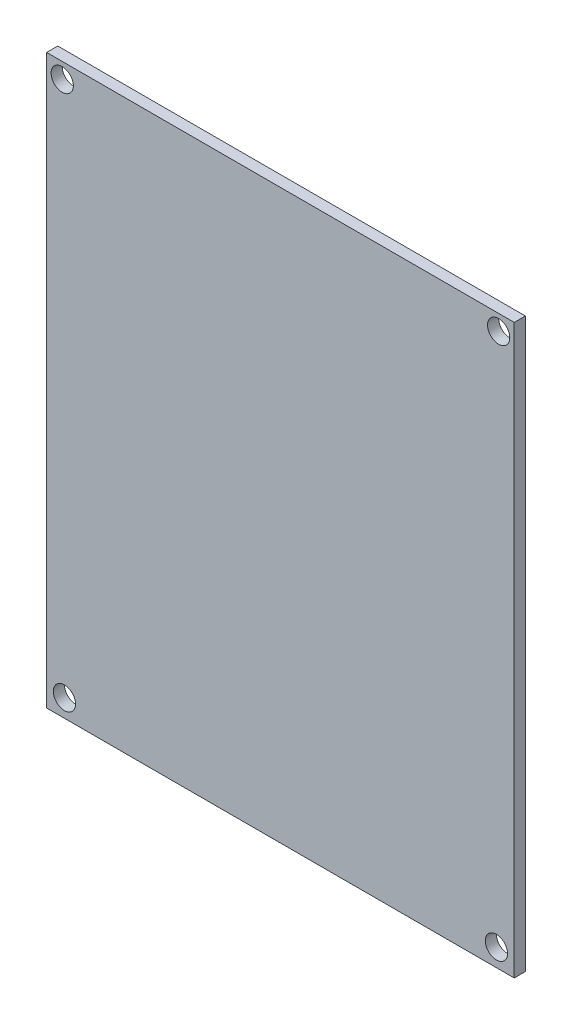
ISO-10303-21;
HEADER;
FILE_DESCRIPTION(('STEP AP214'),'2;1');
FILE_NAME('part.step','',(''),(''),'','','');
FILE_SCHEMA(('AUTOMOTIVE_DESIGN { 1 0 10303 214 1 1 1 1 }'));
ENDSEC;
DATA;
#1=APPLICATION_CONTEXT('core data for automotive mechanical design processes');
#2=APPLICATION_PROTOCOL_DEFINITION('international standard','automotive_design',2000,#1);
#3=PRODUCT_CONTEXT('',#1,'mechanical');
#4=PRODUCT('Part','Part','',(#3));
#5=PRODUCT_RELATED_PRODUCT_CATEGORY('part','',(#4));
#6=PRODUCT_DEFINITION_FORMATION('','',#4);
#7=PRODUCT_DEFINITION_CONTEXT('part definition',#1,'design');
#8=PRODUCT_DEFINITION('design','',#6,#7);
#9=PRODUCT_DEFINITION_SHAPE('','',#8);
#10=(LENGTH_UNIT() NAMED_UNIT(*) SI_UNIT(.MILLI.,.METRE.));
#11=(NAMED_UNIT(*) PLANE_ANGLE_UNIT() SI_UNIT($,.RADIAN.));
#12=(NAMED_UNIT(*) SI_UNIT($,.STERADIAN.) SOLID_ANGLE_UNIT());
#13=UNCERTAINTY_MEASURE_WITH_UNIT(LENGTH_MEASURE(1.E-05),#10,'distance_accuracy_value','');
#14=(GEOMETRIC_REPRESENTATION_CONTEXT(3) GLOBAL_UNCERTAINTY_ASSIGNED_CONTEXT((#13)) GLOBAL_UNIT_ASSIGNED_CONTEXT((#10,
#11,#12)) REPRESENTATION_CONTEXT('',''));
#15=CARTESIAN_POINT('',(0.,0.,0.));
#16=DIRECTION('',(0.,0.,1.));
#17=DIRECTION('',(1.,0.,0.));
#18=AXIS2_PLACEMENT_3D('',#15,#16,#17);
#19=CARTESIAN_POINT('',(0.,0.,4.99999));
#20=DIRECTION('',(0.,0.,1.));
#21=DIRECTION('',(1.,0.,0.));
#22=AXIS2_PLACEMENT_3D('',#19,#20,#21);
#23=PLANE('',#22);
#24=CARTESIAN_POINT('',(98.,-69.2154765022984,4.99999));
#25=DIRECTION('',(0.,0.,1.));
#26=DIRECTION('',(1.,0.,0.));
#27=AXIS2_PLACEMENT_3D('',#24,#25,#26);
#28=CIRCLE('',#27,5.00000000000001);
#29=CARTESIAN_POINT('',(103.,-69.2154765022984,4.99999));
#30=VERTEX_POINT('',#29);
#31=EDGE_CURVE('E135',#30,#30,#28,.T.);
#32=ORIENTED_EDGE('',*,*,#31,.F.);
#33=EDGE_LOOP('',(#32));
#34=FACE_BOUND('',#33,.T.);
#35=CARTESIAN_POINT('',(-97.,-309.215476502298,4.99999));
#36=DIRECTION('',(0.,0.,1.));
#37=DIRECTION('',(1.,0.,0.));
#38=AXIS2_PLACEMENT_3D('',#35,#36,#37);
#39=CIRCLE('',#38,5.00000000000002);
#40=CARTESIAN_POINT('',(-91.9999999999999,-309.215476502298,4.99999));
#41=VERTEX_POINT('',#40);
#42=EDGE_CURVE('E114',#41,#41,#39,.T.);
#43=ORIENTED_EDGE('',*,*,#42,.F.);
#44=EDGE_LOOP('',(#43));
#45=FACE_BOUND('',#44,.T.);
#46=DIRECTION('',(0.,1.,0.));
#47=VECTOR('',#46,1.);
#48=CARTESIAN_POINT('',(105.,-317.215476502298,4.99999));
#49=LINE('',#48,#47);
#50=CARTESIAN_POINT('',(105.,-317.215476502298,4.99999));
#51=VERTEX_POINT('',#50);
#52=CARTESIAN_POINT('',(105.,-62.2154765022984,4.99999));
#53=VERTEX_POINT('',#52);
#54=EDGE_CURVE('E99',#51,#53,#49,.T.);
#55=ORIENTED_EDGE('',*,*,#54,.T.);
#56=DIRECTION('',(-1.,0.,0.));
#57=VECTOR('',#56,1.);
#58=CARTESIAN_POINT('',(105.,-62.2154765022984,4.99999));
#59=LINE('',#58,#57);
#60=CARTESIAN_POINT('',(-105.,-62.2154765022984,4.99999));
#61=VERTEX_POINT('',#60);
#62=EDGE_CURVE('E94',#53,#61,#59,.T.);
#63=ORIENTED_EDGE('',*,*,#62,.T.);
#64=DIRECTION('',(0.,-1.,0.));
#65=VECTOR('',#64,1.);
#66=CARTESIAN_POINT('',(-105.,-317.215476502298,4.99999));
#67=LINE('',#66,#65);
#68=CARTESIAN_POINT('',(-105.,-317.215476502298,4.99999));
#69=VERTEX_POINT('',#68);
#70=EDGE_CURVE('E97',#61,#69,#67,.T.);
#71=ORIENTED_EDGE('',*,*,#70,.T.);
#72=DIRECTION('',(1.,0.,0.));
#73=VECTOR('',#72,1.);
#74=CARTESIAN_POINT('',(105.,-317.215476502298,4.99999));
#75=LINE('',#74,#73);
#76=EDGE_CURVE('E64',#69,#51,#75,.T.);
#77=ORIENTED_EDGE('',*,*,#76,.T.);
#78=EDGE_LOOP('',(#55,#63,#71,#77));
#79=FACE_BOUND('',#78,.T.);
#80=CARTESIAN_POINT('',(97.,-309.215476502298,4.99999));
#81=DIRECTION('',(0.,0.,1.));
#82=DIRECTION('',(1.,0.,0.));
#83=AXIS2_PLACEMENT_3D('',#80,#81,#82);
#84=CIRCLE('',#83,4.99999999999999);
#85=CARTESIAN_POINT('',(102.,-309.215476502298,4.99999));
#86=VERTEX_POINT('',#85);
#87=EDGE_CURVE('E129',#86,#86,#84,.T.);
#88=ORIENTED_EDGE('',*,*,#87,.F.);
#89=EDGE_LOOP('',(#88));
#90=FACE_BOUND('',#89,.T.);
#91=CARTESIAN_POINT('',(-97.9999999999999,-69.2154765022984,4.99999));
#92=DIRECTION('',(0.,0.,1.));
#93=DIRECTION('',(1.,0.,0.));
#94=AXIS2_PLACEMENT_3D('',#91,#92,#93);
#95=CIRCLE('',#94,4.99999999999999);
#96=CARTESIAN_POINT('',(-93.,-69.2154765022984,4.99999));
#97=VERTEX_POINT('',#96);
#98=EDGE_CURVE('E141',#97,#97,#95,.T.);
#99=ORIENTED_EDGE('',*,*,#98,.F.);
#100=EDGE_LOOP('',(#99));
#101=FACE_BOUND('',#100,.T.);
#102=ADVANCED_FACE('F47',(#34,#45,#79,#90,#101),#23,.T.);
#103=CARTESIAN_POINT('',(0.,0.,0.));
#104=DIRECTION('',(0.,0.,1.));
#105=DIRECTION('',(1.,0.,0.));
#106=AXIS2_PLACEMENT_3D('',#103,#104,#105);
#107=PLANE('',#106);
#108=DIRECTION('',(0.,1.,0.));
#109=VECTOR('',#108,1.);
#110=CARTESIAN_POINT('',(105.,-317.215476502298,0.));
#111=LINE('',#110,#109);
#112=CARTESIAN_POINT('',(105.,-317.215476502298,0.));
#113=VERTEX_POINT('',#112);
#114=CARTESIAN_POINT('',(105.,-62.2154765022984,0.));
#115=VERTEX_POINT('',#114);
#116=EDGE_CURVE('E111',#113,#115,#111,.T.);
#117=ORIENTED_EDGE('',*,*,#116,.F.);
#118=DIRECTION('',(1.,0.,0.));
#119=VECTOR('',#118,1.);
#120=CARTESIAN_POINT('',(105.,-317.215476502298,0.));
#121=LINE('',#120,#119);
#122=CARTESIAN_POINT('',(-105.,-317.215476502298,0.));
#123=VERTEX_POINT('',#122);
#124=EDGE_CURVE('E87',#123,#113,#121,.T.);
#125=ORIENTED_EDGE('',*,*,#124,.F.);
#126=DIRECTION('',(0.,-1.,0.));
#127=VECTOR('',#126,1.);
#128=CARTESIAN_POINT('',(-105.,-317.215476502298,0.));
#129=LINE('',#128,#127);
#130=CARTESIAN_POINT('',(-105.,-62.2154765022984,0.));
#131=VERTEX_POINT('',#130);
#132=EDGE_CURVE('E81',#131,#123,#129,.T.);
#133=ORIENTED_EDGE('',*,*,#132,.F.);
#134=DIRECTION('',(-1.,0.,0.));
#135=VECTOR('',#134,1.);
#136=CARTESIAN_POINT('',(105.,-62.2154765022984,0.));
#137=LINE('',#136,#135);
#138=EDGE_CURVE('E103',#115,#131,#137,.T.);
#139=ORIENTED_EDGE('',*,*,#138,.F.);
#140=EDGE_LOOP('',(#117,#125,#133,#139));
#141=FACE_BOUND('',#140,.T.);
#142=CARTESIAN_POINT('',(-97.,-309.215476502298,0.));
#143=DIRECTION('',(0.,0.,1.));
#144=DIRECTION('',(1.,0.,0.));
#145=AXIS2_PLACEMENT_3D('',#142,#143,#144);
#146=CIRCLE('',#145,5.00000000000002);
#147=CARTESIAN_POINT('',(-91.9999999999999,-309.215476502298,0.));
#148=VERTEX_POINT('',#147);
#149=EDGE_CURVE('E126',#148,#148,#146,.T.);
#150=ORIENTED_EDGE('',*,*,#149,.T.);
#151=EDGE_LOOP('',(#150));
#152=FACE_BOUND('',#151,.T.);
#153=CARTESIAN_POINT('',(97.,-309.215476502298,0.));
#154=DIRECTION('',(0.,0.,1.));
#155=DIRECTION('',(1.,0.,0.));
#156=AXIS2_PLACEMENT_3D('',#153,#154,#155);
#157=CIRCLE('',#156,4.99999999999999);
#158=CARTESIAN_POINT('',(102.,-309.215476502298,0.));
#159=VERTEX_POINT('',#158);
#160=EDGE_CURVE('E132',#159,#159,#157,.T.);
#161=ORIENTED_EDGE('',*,*,#160,.T.);
#162=EDGE_LOOP('',(#161));
#163=FACE_BOUND('',#162,.T.);
#164=CARTESIAN_POINT('',(98.,-69.2154765022984,0.));
#165=DIRECTION('',(0.,0.,1.));
#166=DIRECTION('',(1.,0.,0.));
#167=AXIS2_PLACEMENT_3D('',#164,#165,#166);
#168=CIRCLE('',#167,5.00000000000001);
#169=CARTESIAN_POINT('',(103.,-69.2154765022984,0.));
#170=VERTEX_POINT('',#169);
#171=EDGE_CURVE('E138',#170,#170,#168,.T.);
#172=ORIENTED_EDGE('',*,*,#171,.T.);
#173=EDGE_LOOP('',(#172));
#174=FACE_BOUND('',#173,.T.);
#175=CARTESIAN_POINT('',(-97.9999999999999,-69.2154765022984,0.));
#176=DIRECTION('',(0.,0.,1.));
#177=DIRECTION('',(1.,0.,0.));
#178=AXIS2_PLACEMENT_3D('',#175,#176,#177);
#179=CIRCLE('',#178,4.99999999999999);
#180=CARTESIAN_POINT('',(-93.,-69.2154765022984,0.));
#181=VERTEX_POINT('',#180);
#182=EDGE_CURVE('E144',#181,#181,#179,.T.);
#183=ORIENTED_EDGE('',*,*,#182,.T.);
#184=EDGE_LOOP('',(#183));
#185=FACE_BOUND('',#184,.T.);
#186=ADVANCED_FACE('F122',(#141,#152,#163,#174,#185),#107,.F.);
#187=CARTESIAN_POINT('',(105.,-317.215476502298,4.99999));
#188=DIRECTION('',(-1.,0.,0.));
#189=DIRECTION('',(0.,0.,1.));
#190=AXIS2_PLACEMENT_3D('',#187,#188,#189);
#191=PLANE('',#190);
#192=ORIENTED_EDGE('',*,*,#116,.T.);
#193=DIRECTION('',(0.,0.,-1.));
#194=VECTOR('',#193,1.);
#195=CARTESIAN_POINT('',(105.,-62.2154765022984,4.99999));
#196=LINE('',#195,#194);
#197=EDGE_CURVE('E13',#53,#115,#196,.T.);
#198=ORIENTED_EDGE('',*,*,#197,.F.);
#199=ORIENTED_EDGE('',*,*,#54,.F.);
#200=DIRECTION('',(0.,0.,-1.));
#201=VECTOR('',#200,1.);
#202=CARTESIAN_POINT('',(105.,-317.215476502298,4.99999));
#203=LINE('',#202,#201);
#204=EDGE_CURVE('E107',#51,#113,#203,.T.);
#205=ORIENTED_EDGE('',*,*,#204,.T.);
#206=EDGE_LOOP('',(#192,#198,#199,#205));
#207=FACE_BOUND('',#206,.T.);
#208=ADVANCED_FACE('F49',(#207),#191,.F.);
#209=CARTESIAN_POINT('',(105.,-62.2154765022984,4.99999));
#210=DIRECTION('',(0.,-1.,0.));
#211=DIRECTION('',(0.,0.,-1.));
#212=AXIS2_PLACEMENT_3D('',#209,#210,#211);
#213=PLANE('',#212);
#214=ORIENTED_EDGE('',*,*,#138,.T.);
#215=DIRECTION('',(0.,0.,-1.));
#216=VECTOR('',#215,1.);
#217=CARTESIAN_POINT('',(-105.,-62.2154765022984,4.99999));
#218=LINE('',#217,#216);
#219=EDGE_CURVE('E56',#61,#131,#218,.T.);
#220=ORIENTED_EDGE('',*,*,#219,.F.);
#221=ORIENTED_EDGE('',*,*,#62,.F.);
#222=ORIENTED_EDGE('',*,*,#197,.T.);
#223=EDGE_LOOP('',(#214,#220,#221,#222));
#224=FACE_BOUND('',#223,.T.);
#225=ADVANCED_FACE('F102',(#224),#213,.F.);
#226=CARTESIAN_POINT('',(-105.,-317.215476502298,4.99999));
#227=DIRECTION('',(1.,0.,0.));
#228=DIRECTION('',(0.,0.,-1.));
#229=AXIS2_PLACEMENT_3D('',#226,#227,#228);
#230=PLANE('',#229);
#231=ORIENTED_EDGE('',*,*,#132,.T.);
#232=DIRECTION('',(0.,0.,-1.));
#233=VECTOR('',#232,1.);
#234=CARTESIAN_POINT('',(-105.,-317.215476502298,4.99999));
#235=LINE('',#234,#233);
#236=EDGE_CURVE('E104',#69,#123,#235,.T.);
#237=ORIENTED_EDGE('',*,*,#236,.F.);
#238=ORIENTED_EDGE('',*,*,#70,.F.);
#239=ORIENTED_EDGE('',*,*,#219,.T.);
#240=EDGE_LOOP('',(#231,#237,#238,#239));
#241=FACE_BOUND('',#240,.T.);
#242=ADVANCED_FACE('F105',(#241),#230,.F.);
#243=CARTESIAN_POINT('',(105.,-317.215476502298,4.99999));
#244=DIRECTION('',(0.,1.,0.));
#245=DIRECTION('',(0.,0.,1.));
#246=AXIS2_PLACEMENT_3D('',#243,#244,#245);
#247=PLANE('',#246);
#248=ORIENTED_EDGE('',*,*,#124,.T.);
#249=ORIENTED_EDGE('',*,*,#204,.F.);
#250=ORIENTED_EDGE('',*,*,#76,.F.);
#251=ORIENTED_EDGE('',*,*,#236,.T.);
#252=EDGE_LOOP('',(#248,#249,#250,#251));
#253=FACE_BOUND('',#252,.T.);
#254=ADVANCED_FACE('F119',(#253),#247,.F.);
#255=CARTESIAN_POINT('',(-97.,-309.215476502298,4.99999));
#256=DIRECTION('',(0.,0.,-1.));
#257=DIRECTION('',(-1.,0.,0.));
#258=AXIS2_PLACEMENT_3D('',#255,#256,#257);
#259=CYLINDRICAL_SURFACE('',#258,5.00000000000002);
#260=ORIENTED_EDGE('',*,*,#42,.T.);
#261=EDGE_LOOP('',(#260));
#262=FACE_BOUND('',#261,.T.);
#263=ORIENTED_EDGE('',*,*,#149,.F.);
#264=EDGE_LOOP('',(#263));
#265=FACE_BOUND('',#264,.T.);
#266=ADVANCED_FACE('F163',(#262,#265),#259,.F.);
#267=CARTESIAN_POINT('',(97.,-309.215476502298,4.99999));
#268=DIRECTION('',(0.,0.,-1.));
#269=DIRECTION('',(-1.,0.,0.));
#270=AXIS2_PLACEMENT_3D('',#267,#268,#269);
#271=CYLINDRICAL_SURFACE('',#270,4.99999999999999);
#272=ORIENTED_EDGE('',*,*,#87,.T.);
#273=EDGE_LOOP('',(#272));
#274=FACE_BOUND('',#273,.T.);
#275=ORIENTED_EDGE('',*,*,#160,.F.);
#276=EDGE_LOOP('',(#275));
#277=FACE_BOUND('',#276,.T.);
#278=ADVANCED_FACE('F209',(#274,#277),#271,.F.);
#279=CARTESIAN_POINT('',(98.,-69.2154765022984,4.99999));
#280=DIRECTION('',(0.,0.,-1.));
#281=DIRECTION('',(-1.,0.,0.));
#282=AXIS2_PLACEMENT_3D('',#279,#280,#281);
#283=CYLINDRICAL_SURFACE('',#282,5.00000000000001);
#284=ORIENTED_EDGE('',*,*,#31,.T.);
#285=EDGE_LOOP('',(#284));
#286=FACE_BOUND('',#285,.T.);
#287=ORIENTED_EDGE('',*,*,#171,.F.);
#288=EDGE_LOOP('',(#287));
#289=FACE_BOUND('',#288,.T.);
#290=ADVANCED_FACE('F217',(#286,#289),#283,.F.);
#291=CARTESIAN_POINT('',(-97.9999999999999,-69.2154765022984,4.99999));
#292=DIRECTION('',(0.,0.,-1.));
#293=DIRECTION('',(-1.,0.,0.));
#294=AXIS2_PLACEMENT_3D('',#291,#292,#293);
#295=CYLINDRICAL_SURFACE('',#294,4.99999999999999);
#296=ORIENTED_EDGE('',*,*,#98,.T.);
#297=EDGE_LOOP('',(#296));
#298=FACE_BOUND('',#297,.T.);
#299=ORIENTED_EDGE('',*,*,#182,.F.);
#300=EDGE_LOOP('',(#299));
#301=FACE_BOUND('',#300,.T.);
#302=ADVANCED_FACE('F150',(#298,#301),#295,.F.);
#303=CLOSED_SHELL('',(#102,#186,#208,#225,#242,#254,#266,#278,#290,#302));
#304=MANIFOLD_SOLID_BREP('B2',#303);
#305=ADVANCED_BREP_SHAPE_REPRESENTATION('',(#18,#304),#14);
#306=SHAPE_DEFINITION_REPRESENTATION(#9,#305);
ENDSEC;
END-ISO-10303-21;
